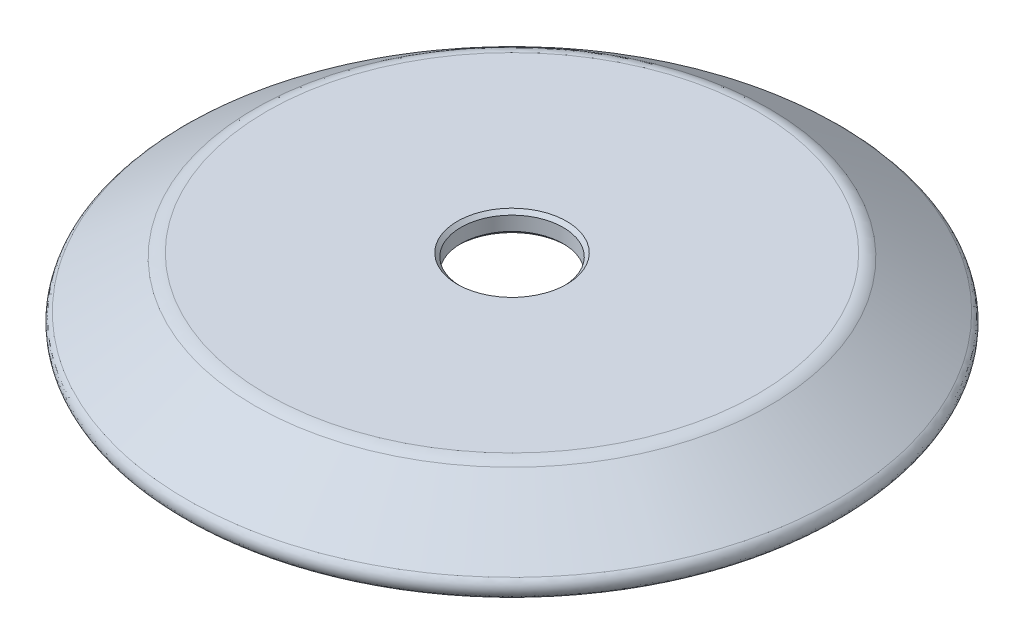
ISO-10303-21;
HEADER;
FILE_DESCRIPTION(('STEP AP214'),'2;1');
FILE_NAME('part.step','',(''),(''),'','','');
FILE_SCHEMA(('AUTOMOTIVE_DESIGN { 1 0 10303 214 1 1 1 1 }'));
ENDSEC;
DATA;
#1=APPLICATION_CONTEXT('core data for automotive mechanical design processes');
#2=APPLICATION_PROTOCOL_DEFINITION('international standard','automotive_design',2000,#1);
#3=PRODUCT_CONTEXT('',#1,'mechanical');
#4=PRODUCT('Part','Part','',(#3));
#5=PRODUCT_RELATED_PRODUCT_CATEGORY('part','',(#4));
#6=PRODUCT_DEFINITION_FORMATION('','',#4);
#7=PRODUCT_DEFINITION_CONTEXT('part definition',#1,'design');
#8=PRODUCT_DEFINITION('design','',#6,#7);
#9=PRODUCT_DEFINITION_SHAPE('','',#8);
#10=(LENGTH_UNIT() NAMED_UNIT(*) SI_UNIT(.MILLI.,.METRE.));
#11=(NAMED_UNIT(*) PLANE_ANGLE_UNIT() SI_UNIT($,.RADIAN.));
#12=(NAMED_UNIT(*) SI_UNIT($,.STERADIAN.) SOLID_ANGLE_UNIT());
#13=UNCERTAINTY_MEASURE_WITH_UNIT(LENGTH_MEASURE(1.E-05),#10,'distance_accuracy_value','');
#14=(GEOMETRIC_REPRESENTATION_CONTEXT(3) GLOBAL_UNCERTAINTY_ASSIGNED_CONTEXT((#13)) GLOBAL_UNIT_ASSIGNED_CONTEXT((#10,
#11,#12)) REPRESENTATION_CONTEXT('',''));
#15=CARTESIAN_POINT('',(0.,0.,0.));
#16=DIRECTION('',(0.,0.,1.));
#17=DIRECTION('',(1.,0.,0.));
#18=AXIS2_PLACEMENT_3D('',#15,#16,#17);
#19=CARTESIAN_POINT('',(-2.5034535638788E-12,2.72872806643349,-46.1029724509817));
#20=CARTESIAN_POINT('',(-6.03707294563587,2.72872806644456,-46.1029724509656));
#21=CARTESIAN_POINT('',(-12.0653156088882,2.72872806647997,-44.903880431653));
#22=CARTESIAN_POINT('',(-23.2203718706661,2.72872806638704,-40.2833048391326));
#23=CARTESIAN_POINT('',(-28.3308692345403,2.72872806642062,-36.8685796713777));
#24=CARTESIAN_POINT('',(-36.8685796713548,2.72872806644637,-28.3308692345103));
#25=CARTESIAN_POINT('',(-40.283304839094,2.72872806643817,-23.2203718705701));
#26=CARTESIAN_POINT('',(-44.9038804316953,2.72872806642883,-12.065315608975));
#27=CARTESIAN_POINT('',(-46.1029724509819,2.72872806643364,-6.03707294569086));
#28=CARTESIAN_POINT('',(-46.1029724509816,2.72872806643333,6.03707294569586));
#29=CARTESIAN_POINT('',(-44.9038804317165,2.72872806641405,12.0653156089808));
#30=CARTESIAN_POINT('',(-40.283304839069,2.72872806645297,23.2203718705736));
#31=CARTESIAN_POINT('',(-36.8685796713791,2.72872806637898,28.330869234623));
#32=CARTESIAN_POINT('',(-28.3308692345089,2.72872806648803,36.8685796712721));
#33=CARTESIAN_POINT('',(-23.220371870538,2.72872806647551,40.2833048390496));
#34=CARTESIAN_POINT('',(-12.0653156090071,2.72872806639147,44.9038804317398));
#35=CARTESIAN_POINT('',(-6.03707294565799,2.72872806642242,46.1029724509979));
#36=CARTESIAN_POINT('',(6.03707294566301,2.72872806644456,46.1029724509656));
#37=CARTESIAN_POINT('',(12.0653156089407,2.72872806639748,44.9038804317587));
#38=CARTESIAN_POINT('',(23.2203718706135,2.72872806646963,40.2833048390267));
#39=CARTESIAN_POINT('',(28.3308692346949,2.72872806630778,36.868579671451));
#40=CARTESIAN_POINT('',(36.8685796712002,2.72872806655919,28.330869234437));
#41=CARTESIAN_POINT('',(40.2833048390501,2.72872806645609,23.2203718706094));
#42=CARTESIAN_POINT('',(44.9038804317392,2.72872806641101,12.0653156089356));
#43=CARTESIAN_POINT('',(46.1029724509807,2.72872806643448,6.03707294563086));
#44=CARTESIAN_POINT('',(46.1029724509828,2.7287280664325,-6.03707294563587));
#45=CARTESIAN_POINT('',(44.9038804317659,2.72872806636164,-12.0653156090573));
#46=CARTESIAN_POINT('',(40.2833048390197,2.72872806650534,-23.2203718704971));
#47=CARTESIAN_POINT('',(36.8685796713803,2.72872806640802,-28.3308692345632));
#48=CARTESIAN_POINT('',(28.3308692345077,2.72872806645898,-36.8685796713319));
#49=CARTESIAN_POINT('',(23.2203718704771,2.72872806651793,-40.2833048390092));
#50=CARTESIAN_POINT('',(12.0653156090679,2.72872806634905,-44.9038804317802));
#51=CARTESIAN_POINT('',(6.03707294563086,2.72872806642242,-46.1029724509979));
#52=CARTESIAN_POINT('',(-2.5034535638788E-12,2.72872806643349,-46.1029724509817));
#53=CARTESIAN_POINT('',(-2.54827876254248E-12,2.15515163008244,-46.9221244952707));
#54=CARTESIAN_POINT('',(-6.14565629281166,2.15515163009134,-46.9221244952504));
#55=CARTESIAN_POINT('',(-12.2784735926816,2.15515163014219,-45.7022312874216));
#56=CARTESIAN_POINT('',(-23.6341657187477,2.15515163002274,-40.9985495988307));
#57=CARTESIAN_POINT('',(-28.83331717872,2.1551516300545,-37.5245876578507));
#58=CARTESIAN_POINT('',(-37.5245876578542,2.15515163011042,-28.8333171787164));
#59=CARTESIAN_POINT('',(-40.9985495988123,2.15515163009263,-23.6341657186007));
#60=CARTESIAN_POINT('',(-45.7022312874439,2.1551516300723,-12.2784735928192));
#61=CARTESIAN_POINT('',(-46.9221244952707,2.15515163008244,-6.14565629292368));
#62=CARTESIAN_POINT('',(-46.9221244952707,2.15515163008244,6.14565629292877));
#63=CARTESIAN_POINT('',(-45.7022312874419,2.15515163003927,12.2784735928239));
#64=CARTESIAN_POINT('',(-40.9985495988103,2.15515163012568,23.6341657186054));
#65=CARTESIAN_POINT('',(-37.5245876577897,2.15515162998843,28.8333171788217));
#66=CARTESIAN_POINT('',(-28.8333171787774,2.1551516301765,37.5245876577526));
#67=CARTESIAN_POINT('',(-23.63416571856,2.1551516301536,40.9985495988123));
#68=CARTESIAN_POINT('',(-12.2784735928599,2.15515163001128,45.7022312874439));
#69=CARTESIAN_POINT('',(-6.14565629285954,2.15515163007101,46.9221244952911));
#70=CARTESIAN_POINT('',(6.14565629286465,2.15515163009388,46.9221244952504));
#71=CARTESIAN_POINT('',(12.2784735927323,2.15515163002028,45.7022312875029));
#72=CARTESIAN_POINT('',(23.6341657186968,2.15515163014481,40.9985495987493));
#73=CARTESIAN_POINT('',(28.8333171788624,2.15515162988929,37.524587657871));
#74=CARTESIAN_POINT('',(37.5245876577119,2.1551516302756,28.8333171786961));
#75=CARTESIAN_POINT('',(40.9985495987716,2.15515163012574,23.6341657186717));
#76=CARTESIAN_POINT('',(45.7022312874845,2.15515163003933,12.278473592748));
#77=CARTESIAN_POINT('',(46.9221244952707,2.15515163008498,6.14565629280657));
#78=CARTESIAN_POINT('',(46.9221244952707,2.1551516300799,-6.14565629281167));
#79=CARTESIAN_POINT('',(45.7022312874826,2.15515162997825,-12.2784735929459));
#80=CARTESIAN_POINT('',(40.9985495987697,2.15515163018665,-23.6341657184833));
#81=CARTESIAN_POINT('',(37.5245876578506,2.15515163003798,-28.8333171787404));
#82=CARTESIAN_POINT('',(28.8333171787164,2.15515163012694,-37.5245876578339));
#83=CARTESIAN_POINT('',(23.6341657184786,2.1551516302235,-40.9985495988123));
#84=CARTESIAN_POINT('',(12.2784735929411,2.15515162994139,-45.7022312874439));
#85=CARTESIAN_POINT('',(6.14565629280657,2.15515163007355,-46.9221244952911));
#86=CARTESIAN_POINT('',(-2.54827876254248E-12,2.15515163008244,-46.9221244952707));
#87=CARTESIAN_POINT('',(-2.58095078049475E-12,0.823817051426892,-47.5158822233687));
#88=CARTESIAN_POINT('',(-6.22436231810856,0.823817051451672,-47.515882223328));
#89=CARTESIAN_POINT('',(-12.4329799521126,0.823817051497757,-46.2809113916969));
#90=CARTESIAN_POINT('',(-23.9341018500804,0.823817051356068,-41.5169907190756));
#91=CARTESIAN_POINT('',(-29.197513730384,0.823817051419282,-38.0000913379657));
#92=CARTESIAN_POINT('',(-38.0000913380302,0.823817051434531,-29.1975137304414));
#93=CARTESIAN_POINT('',(-41.5169907191995,0.823817051417701,-23.9341018499028));
#94=CARTESIAN_POINT('',(-46.2809113915769,0.823817051436127,-12.4329799522807));
#95=CARTESIAN_POINT('',(-47.5158822233687,0.823817051426892,-6.22436231827691));
#96=CARTESIAN_POINT('',(-47.5158822233687,0.823817051426892,6.22436231828207));
#97=CARTESIAN_POINT('',(-46.2809113915749,0.823817051389117,12.4329799523058));
#98=CARTESIAN_POINT('',(-41.5169907191975,0.823817051464727,23.9341018498872));
#99=CARTESIAN_POINT('',(-38.0000913379046,0.823817051325884,29.197513730506));
#100=CARTESIAN_POINT('',(-29.1975137305024,0.823817051527934,38.0000913379083));
#101=CARTESIAN_POINT('',(-23.9341018498621,0.823817051484712,41.5169907191792));
#102=CARTESIAN_POINT('',(-12.4329799523213,0.823817051369073,46.2809113915972));
#103=CARTESIAN_POINT('',(-6.22436231816649,0.823817051441508,47.5158822233484));
#104=CARTESIAN_POINT('',(6.22436231817167,0.82381705141228,47.515882223389));
#105=CARTESIAN_POINT('',(12.4329799521227,0.823817051366624,46.280911391697));
#106=CARTESIAN_POINT('',(23.9341018500701,0.823817051487346,41.5169907190756));
#107=CARTESIAN_POINT('',(29.1975137304654,0.82381705120197,38.0000913378843));
#108=CARTESIAN_POINT('',(38.0000913379489,0.823817051651819,29.1975137305227));
#109=CARTESIAN_POINT('',(41.5169907190572,0.823817051498783,23.9341018499942));
#110=CARTESIAN_POINT('',(46.2809113917193,0.823817051355187,12.4329799521891));
#111=CARTESIAN_POINT('',(47.5158822233484,0.823817051426892,6.22436231807452));
#112=CARTESIAN_POINT('',(47.515882223389,0.823817051426892,-6.22436231807969));
#113=CARTESIAN_POINT('',(46.2809113915749,0.823817051278214,-12.4329799524582));
#114=CARTESIAN_POINT('',(41.5169907191976,0.823817051575571,-23.9341018497347));
#115=CARTESIAN_POINT('',(38.0000913379453,0.823817051384972,-29.197513730445));
#116=CARTESIAN_POINT('',(29.1975137304617,0.823817051468842,-38.0000913379693));
#117=CARTESIAN_POINT('',(23.9341018497706,0.823817051553338,-41.5169907192605));
#118=CARTESIAN_POINT('',(12.4329799524128,0.823817051300458,-46.2809113915159));
#119=CARTESIAN_POINT('',(6.2243623181034,0.823817051402112,-47.5158822234094));
#120=CARTESIAN_POINT('',(-2.58095078049475E-12,0.823817051426892,-47.5158822233687));
#121=CARTESIAN_POINT('',(-2.53423181974011E-12,-0.404911015006596,-46.6555175688421));
#122=CARTESIAN_POINT('',(-6.11031600076284,-0.404911014977209,-46.6555175688218));
#123=CARTESIAN_POINT('',(-12.2090977114299,-0.404911014952268,-45.442394460713));
#124=CARTESIAN_POINT('',(-23.4994894926033,-0.404911015060918,-40.7657610604331));
#125=CARTESIAN_POINT('',(-28.6697869732652,-0.404911014985467,-37.3110787320666));
#126=CARTESIAN_POINT('',(-37.3110787321311,-0.40491101502772,-28.6697869733227));
#127=CARTESIAN_POINT('',(-40.7657610605164,-0.404911015042648,-23.499489492436));
#128=CARTESIAN_POINT('',(-45.4423944606336,-0.404911014970533,-12.2090977115879));
#129=CARTESIAN_POINT('',(-46.6555175688421,-0.404911015006596,-6.1103160009013));
#130=CARTESIAN_POINT('',(-46.6555175688421,-0.404911015006596,6.11031600090636));
#131=CARTESIAN_POINT('',(-45.442394460591,-0.404911015011664,12.2090977115926));
#132=CARTESIAN_POINT('',(-40.7657610605551,-0.404911015001498,23.4994894924406));
#133=CARTESIAN_POINT('',(-37.3110787320055,-0.404911015064885,28.6697869733465));
#134=CARTESIAN_POINT('',(-28.6697869733836,-0.404911014948293,37.3110787320498));
#135=CARTESIAN_POINT('',(-23.4994894924156,-0.404911014999289,40.765761060557));
#136=CARTESIAN_POINT('',(-12.2090977116082,-0.404911015013902,45.4423944605929));
#137=CARTESIAN_POINT('',(-6.11031600077653,-0.404911014960369,46.6555175688421));
#138=CARTESIAN_POINT('',(6.11031600078161,-0.404911015052817,46.6555175688421));
#139=CARTESIAN_POINT('',(12.2090977114502,-0.404911015033893,45.442394460652));
#140=CARTESIAN_POINT('',(23.4994894925829,-0.40491101497925,40.7657610604941));
#141=CARTESIAN_POINT('',(28.6697869732856,-0.404911015143515,37.3110787320055));
#142=CARTESIAN_POINT('',(37.3110787321108,-0.404911014869666,28.6697869733836));
#143=CARTESIAN_POINT('',(40.7657610604757,-0.404911014931742,23.4994894925376));
#144=CARTESIAN_POINT('',(45.4423944606743,-0.404911015081373,12.2090977114862));
#145=CARTESIAN_POINT('',(46.6555175688828,-0.404911015008819,6.11031600067115));
#146=CARTESIAN_POINT('',(46.6555175688015,-0.404911015004372,-6.11031600067622));
#147=CARTESIAN_POINT('',(45.44239446053,-0.404911015130185,-12.2090977117857));
#148=CARTESIAN_POINT('',(40.7657610606161,-0.404911014883023,-23.4994894922475));
#149=CARTESIAN_POINT('',(37.3110787320665,-0.404911015028038,-28.6697869733059));
#150=CARTESIAN_POINT('',(28.6697869733226,-0.404911014985149,-37.3110787320905));
#151=CARTESIAN_POINT('',(23.4994894923343,-0.404911014973071,-40.7657610606383));
#152=CARTESIAN_POINT('',(12.2090977116895,-0.404911015040103,-45.4423944605116));
#153=CARTESIAN_POINT('',(6.11031600075777,-0.404911015035982,-46.6555175688624));
#154=CARTESIAN_POINT('',(-2.53423181974011E-12,-0.404911015006596,-46.6555175688421));
#155=CARTESIAN_POINT('',(-2.45484084103319E-12,-0.302304502784533,-45.2013951862176));
#156=CARTESIAN_POINT('',(-5.91756365812024,-0.302304502772143,-45.2013951862176));
#157=CARTESIAN_POINT('',(-11.8307091113772,-0.302304502762294,-44.025197425474));
#158=CARTESIAN_POINT('',(-22.7649410037326,-0.302304502806771,-39.4960902815254));
#159=CARTESIAN_POINT('',(-27.7778636645027,-0.302304502775637,-36.1465624460322));
#160=CARTESIAN_POINT('',(-36.1465624460356,-0.302304502793428,-27.7778636644993));
#161=CARTESIAN_POINT('',(-39.4960902815273,-0.302304502800416,-22.7649410036772));
#162=CARTESIAN_POINT('',(-44.0251974254759,-0.302304502768647,-11.8307091114235));
#163=CARTESIAN_POINT('',(-45.2013951862176,-0.302304502784533,-5.91756365817245));
#164=CARTESIAN_POINT('',(-45.2013951862176,-0.302304502784533,5.91756365817735));
#165=CARTESIAN_POINT('',(-44.0251974254334,-0.302304502785799,11.830709111428));
#166=CARTESIAN_POINT('',(-39.4960902815661,-0.302304502783257,22.7649410036817));
#167=CARTESIAN_POINT('',(-36.1465624459915,-0.302304502807087,27.7778636645231));
#168=CARTESIAN_POINT('',(-27.7778636645399,-0.302304502761975,36.1465624460153));
#169=CARTESIAN_POINT('',(-22.7649410036569,-0.302304502782945,39.4960902815679));
#170=CARTESIAN_POINT('',(-11.8307091114438,-0.302304502786122,44.0251974254352));
#171=CARTESIAN_POINT('',(-5.91756365807962,-0.302304502764836,45.2013951862176));
#172=CARTESIAN_POINT('',(5.91756365808454,-0.302304502804229,45.2013951862176));
#173=CARTESIAN_POINT('',(11.8307091113771,-0.30230450279469,44.0251974254537));
#174=CARTESIAN_POINT('',(22.7649410037325,-0.302304502774358,39.4960902815457));
#175=CARTESIAN_POINT('',(27.7778636644621,-0.302304502840762,36.1465624460118));
#176=CARTESIAN_POINT('',(36.1465624460763,-0.3023045027283,27.7778636645196));
#177=CARTESIAN_POINT('',(39.4960902815679,-0.302304502752432,22.7649410037179));
#178=CARTESIAN_POINT('',(44.0251974254353,-0.302304502816605,11.8307091113828));
#179=CARTESIAN_POINT('',(45.2013951862176,-0.302304502785169,5.91756365799982));
#180=CARTESIAN_POINT('',(45.2013951862176,-0.302304502783898,-5.91756365800473));
#181=CARTESIAN_POINT('',(44.025197425352,-0.30230450283632,-11.8307091115805));
#182=CARTESIAN_POINT('',(39.4960902816474,-0.302304502732754,-22.7649410035292));
#183=CARTESIAN_POINT('',(36.1465624460525,-0.302304502792793,-27.7778636644824));
#184=CARTESIAN_POINT('',(27.7778636644789,-0.302304502776273,-36.1465624460559));
#185=CARTESIAN_POINT('',(22.7649410036365,-0.302304502770869,-39.4960902815883));
#186=CARTESIAN_POINT('',(11.8307091114641,-0.302304502798191,-44.0251974254149));
#187=CARTESIAN_POINT('',(5.91756365811533,-0.302304502796923,-45.2013951862176));
#188=CARTESIAN_POINT('',(-2.45484084103319E-12,-0.302304502784533,-45.2013951862176));
#189=CARTESIAN_POINT('',(-2.41001564236951E-12,0.271271933566512,-44.3822431419286));
#190=CARTESIAN_POINT('',(-5.80898031094444,0.271271933566364,-44.3822431419285));
#191=CARTESIAN_POINT('',(-11.6175511275745,0.271271933575168,-43.2268465696869));
#192=CARTESIAN_POINT('',(-22.3511471556604,0.271271933557858,-38.7808455218458));
#193=CARTESIAN_POINT('',(-27.2754157203005,0.271271933565824,-35.4905544595571));
#194=CARTESIAN_POINT('',(-35.4905544595586,0.271271933567202,-27.2754157202953));
#195=CARTESIAN_POINT('',(-38.7808455218322,0.271271933570481,-22.3511471556478));
#196=CARTESIAN_POINT('',(-43.2268465697042,0.271271933562546,-11.6175511275782));
#197=CARTESIAN_POINT('',(-44.3822431419287,0.27127193356666,-5.80898031093962));
#198=CARTESIAN_POINT('',(-44.3822431419285,0.271271933566364,5.80898031094444));
#199=CARTESIAN_POINT('',(-43.2268465696897,0.271271933573078,11.6175511275756));
#200=CARTESIAN_POINT('',(-38.780845521843,0.271271933559949,22.3511471556593));
#201=CARTESIAN_POINT('',(-35.4905544595579,0.271271933564989,27.2754157203014));
#202=CARTESIAN_POINT('',(-27.2754157202944,0.271271933568037,35.4905544595578));
#203=CARTESIAN_POINT('',(-22.3511471556472,0.271271933571733,38.7808455218305));
#204=CARTESIAN_POINT('',(-11.6175511275789,0.27127193356129,43.2268465697058));
#205=CARTESIAN_POINT('',(-5.80898031087808,0.27127193356666,44.3822431419287));
#206=CARTESIAN_POINT('',(5.80898031088291,0.271271933566363,44.3822431419285));
#207=CARTESIAN_POINT('',(11.6175511275833,0.271271933561591,43.2268465697042));
#208=CARTESIAN_POINT('',(22.3511471556515,0.271271933571446,38.7808455218285));
#209=CARTESIAN_POINT('',(27.2754157202827,0.271271933563317,35.4905544595799));
#210=CARTESIAN_POINT('',(35.4905544595764,0.271271933569708,27.2754157202724));
#211=CARTESIAN_POINT('',(38.7808455218439,0.271271933561086,22.3511471556545));
#212=CARTESIAN_POINT('',(43.2268465696924,0.271271933571949,11.6175511275715));
#213=CARTESIAN_POINT('',(44.3822431419281,0.271271933567078,5.80898031082411));
#214=CARTESIAN_POINT('',(44.3822431419291,0.271271933565945,-5.80898031082894));
#215=CARTESIAN_POINT('',(43.2268465696491,0.271271933569365,-11.6175511276874));
#216=CARTESIAN_POINT('',(38.7808455218836,0.271271933563659,-22.3511471555474));
#217=CARTESIAN_POINT('',(35.4905544595744,0.271271933558652,-27.2754157202976));
#218=CARTESIAN_POINT('',(27.2754157202779,0.271271933574373,-35.4905544595615));
#219=CARTESIAN_POINT('',(22.351147155646,0.271271933573827,-38.7808455218278));
#220=CARTESIAN_POINT('',(11.61755112758,0.271271933559197,-43.2268465697086));
#221=CARTESIAN_POINT('',(5.80898031093962,0.27127193356666,-44.3822431419287));
#222=CARTESIAN_POINT('',(-2.41001564236951E-12,0.271271933566512,-44.3822431419286));
#223=(BOUNDED_SURFACE() B_SPLINE_SURFACE(5,3,((#19,#20,#21,#22,#23,#24,#25,#26,#27,#28,#29,#30,
#31,#32,#33,#34,#35,#36,#37,#38,#39,#40,#41,#42,#43,#44,#45,#46,#47,#48,#49,#50,#51,#52),(#53,
#54,#55,#56,#57,#58,#59,#60,#61,#62,#63,#64,#65,#66,#67,#68,#69,#70,#71,#72,#73,#74,#75,#76,#77,
#78,#79,#80,#81,#82,#83,#84,#85,#86),(#87,#88,#89,#90,#91,#92,#93,#94,#95,#96,#97,#98,#99,#100,
#101,#102,#103,#104,#105,#106,#107,#108,#109,#110,#111,#112,#113,#114,#115,#116,#117,#118,#119,
#120),(#121,#122,#123,#124,#125,#126,#127,#128,#129,#130,#131,#132,#133,#134,#135,#136,#137,
#138,#139,#140,#141,#142,#143,#144,#145,#146,#147,#148,#149,#150,#151,#152,#153,#154),(#155,
#156,#157,#158,#159,#160,#161,#162,#163,#164,#165,#166,#167,#168,#169,#170,#171,#172,#173,#174,
#175,#176,#177,#178,#179,#180,#181,#182,#183,#184,#185,#186,#187,#188),(#189,#190,#191,#192,
#193,#194,#195,#196,#197,#198,#199,#200,#201,#202,#203,#204,#205,#206,#207,#208,#209,#210,#211,
#212,#213,#214,#215,#216,#217,#218,#219,#220,#221,#222)),.UNSPECIFIED.,.F.,.T.,
.F.) B_SPLINE_SURFACE_WITH_KNOTS((6,6),(4,2,2,2,2,2,2,2,2,2,2,2,2,2,2,2,4),(0.,1.),
(0.500000000000009,0.562500000000009,0.625000000000009,0.687500000000009,0.750000000000009,
0.812500000000009,0.875000000000009,0.937500000000009,1.00000000000001,1.06250000000001,
1.12500000000001,1.18750000000001,1.25000000000001,1.31250000000001,1.37500000000001,
1.43750000000001,1.50000000000001),
.UNSPECIFIED.) GEOMETRIC_REPRESENTATION_ITEM() RATIONAL_B_SPLINE_SURFACE(((1.,1.,1.,1.,1.,1.,1.,
1.,1.,1.,1.,1.,1.,1.,1.,1.,1.,1.,1.,1.,1.,1.,1.,1.,1.,1.,1.,1.,1.,1.,1.,1.,1.,1.),(0.6,0.6,
0.599999999999998,0.599999999999998,0.599999999999998,0.599999999999998,0.599999999999998,
0.599999999999998,0.6,0.6,0.599999999999999,0.599999999999999,0.599999999999999,
0.599999999999999,0.6,0.6,0.6,0.6,0.599999999999992,0.599999999999992,0.600000000000001,
0.600000000000001,0.599999999999994,0.599999999999994,0.6,0.6,0.599999999999999,
0.599999999999999,0.599999999999998,0.599999999999998,0.600000000000001,0.600000000000001,0.6,
0.6),(0.4,0.4,0.399999999999997,0.399999999999997,0.399999999999998,0.399999999999998,
0.399999999999997,0.399999999999997,0.4,0.4,0.399999999999998,0.399999999999998,
0.399999999999999,0.399999999999999,0.4,0.4,0.4,0.4,0.399999999999988,0.399999999999988,
0.400000000000001,0.400000000000001,0.399999999999991,0.399999999999991,0.4,0.4,
0.399999999999998,0.399999999999998,0.399999999999998,0.399999999999998,0.400000000000002,
0.400000000000002,0.4,0.4),(0.4,0.4,0.399999999999997,0.399999999999997,0.399999999999998,
0.399999999999998,0.399999999999997,0.399999999999997,0.4,0.4,0.399999999999998,
0.399999999999998,0.399999999999999,0.399999999999999,0.4,0.4,0.4,0.4,0.399999999999988,
0.399999999999988,0.400000000000001,0.400000000000001,0.399999999999991,0.399999999999991,0.4,
0.4,0.399999999999998,0.399999999999998,0.399999999999998,0.399999999999998,0.400000000000002,
0.400000000000002,0.4,0.4),(0.6,0.6,0.599999999999998,0.599999999999998,0.599999999999998,
0.599999999999998,0.599999999999998,0.599999999999998,0.6,0.6,0.599999999999999,
0.599999999999999,0.599999999999999,0.599999999999999,0.6,0.6,0.6,0.6,0.599999999999992,
0.599999999999992,0.600000000000001,0.600000000000001,0.599999999999994,0.599999999999994,0.6,
0.6,0.599999999999999,0.599999999999999,0.599999999999998,0.599999999999998,0.600000000000001,
0.600000000000001,0.6,0.6),(1.,1.,1.,1.,1.,1.,1.,1.,1.,1.,1.,1.,1.,1.,1.,1.,1.,1.,1.,1.,1.,1.,
1.,1.,1.,1.,1.,1.,1.,1.,1.,1.,1.,1.))) REPRESENTATION_ITEM('') SURFACE());
#224=CARTESIAN_POINT('',(-2.41001564236951E-12,0.271271933566512,-44.3822431419286));
#225=CARTESIAN_POINT('',(-5.80898031094444,0.271271933566364,-44.3822431419285));
#226=CARTESIAN_POINT('',(-11.6175511275745,0.271271933575168,-43.2268465696869));
#227=CARTESIAN_POINT('',(-22.3511471556604,0.271271933557858,-38.7808455218458));
#228=CARTESIAN_POINT('',(-27.2754157203005,0.271271933565824,-35.4905544595571));
#229=CARTESIAN_POINT('',(-35.4905544595586,0.271271933567202,-27.2754157202953));
#230=CARTESIAN_POINT('',(-38.7808455218322,0.271271933570481,-22.3511471556478));
#231=CARTESIAN_POINT('',(-43.2268465697042,0.271271933562546,-11.6175511275782));
#232=CARTESIAN_POINT('',(-44.3822431419287,0.27127193356666,-5.80898031093962));
#233=CARTESIAN_POINT('',(-44.3822431419285,0.271271933566364,5.80898031094444));
#234=CARTESIAN_POINT('',(-43.2268465696897,0.271271933573078,11.6175511275756));
#235=CARTESIAN_POINT('',(-38.780845521843,0.271271933559949,22.3511471556593));
#236=CARTESIAN_POINT('',(-35.4905544595579,0.271271933564989,27.2754157203014));
#237=CARTESIAN_POINT('',(-27.2754157202944,0.271271933568037,35.4905544595578));
#238=CARTESIAN_POINT('',(-22.3511471556472,0.271271933571733,38.7808455218305));
#239=CARTESIAN_POINT('',(-11.6175511275789,0.27127193356129,43.2268465697058));
#240=CARTESIAN_POINT('',(-5.80898031087808,0.27127193356666,44.3822431419287));
#241=CARTESIAN_POINT('',(5.80898031088291,0.271271933566363,44.3822431419285));
#242=CARTESIAN_POINT('',(11.6175511275833,0.271271933561591,43.2268465697042));
#243=CARTESIAN_POINT('',(22.3511471556515,0.271271933571446,38.7808455218285));
#244=CARTESIAN_POINT('',(27.2754157202827,0.271271933563317,35.4905544595799));
#245=CARTESIAN_POINT('',(35.4905544595764,0.271271933569708,27.2754157202724));
#246=CARTESIAN_POINT('',(38.7808455218439,0.271271933561086,22.3511471556545));
#247=CARTESIAN_POINT('',(43.2268465696924,0.271271933571949,11.6175511275715));
#248=CARTESIAN_POINT('',(44.3822431419281,0.271271933567078,5.80898031082411));
#249=CARTESIAN_POINT('',(44.3822431419291,0.271271933565945,-5.80898031082894));
#250=CARTESIAN_POINT('',(43.2268465696491,0.271271933569365,-11.6175511276874));
#251=CARTESIAN_POINT('',(38.7808455218836,0.271271933563659,-22.3511471555474));
#252=CARTESIAN_POINT('',(35.4905544595744,0.271271933558652,-27.2754157202976));
#253=CARTESIAN_POINT('',(27.2754157202779,0.271271933574373,-35.4905544595615));
#254=CARTESIAN_POINT('',(22.351147155646,0.271271933573827,-38.7808455218278));
#255=CARTESIAN_POINT('',(11.61755112758,0.271271933559197,-43.2268465697086));
#256=CARTESIAN_POINT('',(5.80898031093962,0.27127193356666,-44.3822431419287));
#257=CARTESIAN_POINT('',(-2.41001564236951E-12,0.271271933566512,-44.3822431419286));
#258=(BOUNDED_CURVE() B_SPLINE_CURVE(3,(#224,#225,#226,#227,#228,#229,#230,#231,#232,#233,#234,
#235,#236,#237,#238,#239,#240,#241,#242,#243,#244,#245,#246,#247,#248,#249,#250,#251,#252,#253,
#254,#255,#256,#257),.UNSPECIFIED.,.T.,.F.) B_SPLINE_CURVE_WITH_KNOTS((4,2,2,2,2,2,2,2,2,2,2,2,
2,2,2,2,4),(0.500000000000009,0.562500000000009,0.625000000000009,0.687500000000009,
0.750000000000009,0.812500000000009,0.875000000000009,0.937500000000009,1.00000000000001,
1.06250000000001,1.12500000000001,1.18750000000001,1.25000000000001,1.31250000000001,
1.37500000000001,1.43750000000001,1.50000000000001),
.UNSPECIFIED.) CURVE() GEOMETRIC_REPRESENTATION_ITEM() RATIONAL_B_SPLINE_CURVE((1.,1.,1.,1.,1.,
1.,1.,1.,1.,1.,1.,1.,1.,1.,1.,1.,1.,1.,1.,1.,1.,1.,1.,1.,1.,1.,1.,1.,1.,1.,1.,1.,1.,1.)) REPRESENTATION_ITEM(''));
#259=CARTESIAN_POINT('',(-2.41001564236951E-12,0.271271933566512,-44.3822431419286));
#260=VERTEX_POINT('',#259);
#261=EDGE_CURVE('E118',#260,#260,#258,.F.);
#262=CARTESIAN_POINT('',(-2.5034535638788E-12,2.72872806643349,-46.1029724509817));
#263=CARTESIAN_POINT('',(6.03707294563086,2.72872806642242,-46.1029724509979));
#264=CARTESIAN_POINT('',(12.0653156090679,2.72872806634905,-44.9038804317802));
#265=CARTESIAN_POINT('',(23.2203718704771,2.72872806651793,-40.2833048390092));
#266=CARTESIAN_POINT('',(28.3308692345077,2.72872806645898,-36.8685796713319));
#267=CARTESIAN_POINT('',(36.8685796713803,2.72872806640802,-28.3308692345632));
#268=CARTESIAN_POINT('',(40.2833048390197,2.72872806650534,-23.2203718704971));
#269=CARTESIAN_POINT('',(44.9038804317659,2.72872806636164,-12.0653156090573));
#270=CARTESIAN_POINT('',(46.1029724509828,2.7287280664325,-6.03707294563587));
#271=CARTESIAN_POINT('',(46.1029724509807,2.72872806643448,6.03707294563086));
#272=CARTESIAN_POINT('',(44.9038804317392,2.72872806641101,12.0653156089356));
#273=CARTESIAN_POINT('',(40.2833048390501,2.72872806645609,23.2203718706094));
#274=CARTESIAN_POINT('',(36.8685796712002,2.72872806655919,28.330869234437));
#275=CARTESIAN_POINT('',(28.3308692346949,2.72872806630778,36.868579671451));
#276=CARTESIAN_POINT('',(23.2203718706135,2.72872806646963,40.2833048390267));
#277=CARTESIAN_POINT('',(12.0653156089407,2.72872806639748,44.9038804317587));
#278=CARTESIAN_POINT('',(6.03707294566301,2.72872806644456,46.1029724509656));
#279=CARTESIAN_POINT('',(-6.03707294565799,2.72872806642242,46.1029724509979));
#280=CARTESIAN_POINT('',(-12.0653156090071,2.72872806639147,44.9038804317398));
#281=CARTESIAN_POINT('',(-23.220371870538,2.72872806647551,40.2833048390496));
#282=CARTESIAN_POINT('',(-28.3308692345089,2.72872806648803,36.8685796712721));
#283=CARTESIAN_POINT('',(-36.8685796713791,2.72872806637898,28.330869234623));
#284=CARTESIAN_POINT('',(-40.283304839069,2.72872806645297,23.2203718705736));
#285=CARTESIAN_POINT('',(-44.9038804317165,2.72872806641405,12.0653156089808));
#286=CARTESIAN_POINT('',(-46.1029724509816,2.72872806643333,6.03707294569586));
#287=CARTESIAN_POINT('',(-46.1029724509819,2.72872806643364,-6.03707294569086));
#288=CARTESIAN_POINT('',(-44.9038804316953,2.72872806642883,-12.065315608975));
#289=CARTESIAN_POINT('',(-40.283304839094,2.72872806643817,-23.2203718705701));
#290=CARTESIAN_POINT('',(-36.8685796713548,2.72872806644637,-28.3308692345103));
#291=CARTESIAN_POINT('',(-28.3308692345403,2.72872806642062,-36.8685796713777));
#292=CARTESIAN_POINT('',(-23.2203718706661,2.72872806638704,-40.2833048391326));
#293=CARTESIAN_POINT('',(-12.0653156088882,2.72872806647997,-44.903880431653));
#294=CARTESIAN_POINT('',(-6.03707294563587,2.72872806644456,-46.1029724509656));
#295=CARTESIAN_POINT('',(-2.5034535638788E-12,2.72872806643349,-46.1029724509817));
#296=(BOUNDED_CURVE() B_SPLINE_CURVE(3,(#262,#263,#264,#265,#266,#267,#268,#269,#270,#271,#272,
#273,#274,#275,#276,#277,#278,#279,#280,#281,#282,#283,#284,#285,#286,#287,#288,#289,#290,#291,
#292,#293,#294,#295),.UNSPECIFIED.,.T.,.F.) B_SPLINE_CURVE_WITH_KNOTS((4,2,2,2,2,2,2,2,2,2,2,2,
2,2,2,2,4),(0.500000000000009,0.562500000000009,0.625000000000009,0.687500000000009,
0.750000000000009,0.812500000000009,0.875000000000009,0.937500000000009,1.00000000000001,
1.06250000000001,1.12500000000001,1.18750000000001,1.25000000000001,1.31250000000001,
1.37500000000001,1.43750000000001,1.50000000000001),
.UNSPECIFIED.) CURVE() GEOMETRIC_REPRESENTATION_ITEM() RATIONAL_B_SPLINE_CURVE((1.,1.,1.,1.,1.,
1.,1.,1.,1.,1.,1.,1.,1.,1.,1.,1.,1.,1.,1.,1.,1.,1.,1.,1.,1.,1.,1.,1.,1.,1.,1.,1.,1.,1.)) REPRESENTATION_ITEM(''));
#297=CARTESIAN_POINT('',(-2.5034535638788E-12,2.72872806643349,-46.1029724509817));
#298=VERTEX_POINT('',#297);
#299=EDGE_CURVE('E75',#298,#298,#296,.F.);
#300=ORIENTED_EDGE('',*,*,#261,.F.);
#301=EDGE_LOOP('',(#300));
#302=FACE_BOUND('',#301,.T.);
#303=ORIENTED_EDGE('',*,*,#299,.F.);
#304=EDGE_LOOP('',(#303));
#305=FACE_BOUND('',#304,.T.);
#306=ADVANCED_FACE('F43',(#302,#305),#223,.T.);
#307=CARTESIAN_POINT('',(0.,0.,0.));
#308=DIRECTION('',(0.,-1.,0.));
#309=DIRECTION('',(0.,0.,1.));
#310=AXIS2_PLACEMENT_3D('',#307,#308,#309);
#311=CONICAL_SURFACE('',#310,50.,0.959931088596882);
#312=CARTESIAN_POINT('',(0.,9.45745613286696,0.));
#313=DIRECTION('',(0.,-1.,0.));
#314=DIRECTION('',(0.,0.,-1.));
#315=AXIS2_PLACEMENT_3D('',#312,#313,#314);
#316=CIRCLE('',#315,36.493352874995);
#317=CARTESIAN_POINT('',(0.,9.45745613286696,-36.493352874995));
#318=VERTEX_POINT('',#317);
#319=EDGE_CURVE('E10',#318,#318,#316,.T.);
#320=ORIENTED_EDGE('',*,*,#319,.T.);
#321=EDGE_LOOP('',(#320));
#322=FACE_BOUND('',#321,.T.);
#323=ORIENTED_EDGE('',*,*,#299,.T.);
#324=EDGE_LOOP('',(#323));
#325=FACE_BOUND('',#324,.T.);
#326=ADVANCED_FACE('F96',(#322,#325),#311,.T.);
#327=CARTESIAN_POINT('',(0.,10.,0.));
#328=DIRECTION('',(0.,1.,0.));
#329=DIRECTION('',(0.,0.,1.));
#330=AXIS2_PLACEMENT_3D('',#327,#328,#329);
#331=PLANE('',#330);
#332=CARTESIAN_POINT('',(0.,10.,0.));
#333=DIRECTION('',(0.,1.,0.));
#334=DIRECTION('',(0.,0.,1.));
#335=AXIS2_PLACEMENT_3D('',#332,#333,#334);
#336=CIRCLE('',#335,34.7726235659419);
#337=CARTESIAN_POINT('',(0.,10.,34.7726235659419));
#338=VERTEX_POINT('',#337);
#339=EDGE_CURVE('E51',#338,#338,#336,.T.);
#340=ORIENTED_EDGE('',*,*,#339,.T.);
#341=EDGE_LOOP('',(#340));
#342=FACE_BOUND('',#341,.T.);
#343=CARTESIAN_POINT('',(0.,10.,0.));
#344=DIRECTION('',(0.,1.,0.));
#345=DIRECTION('',(0.,0.,1.));
#346=AXIS2_PLACEMENT_3D('',#343,#344,#345);
#347=CIRCLE('',#346,7.74999999999999);
#348=CARTESIAN_POINT('',(0.,10.,7.74999999999999));
#349=VERTEX_POINT('',#348);
#350=EDGE_CURVE('E56',#349,#349,#347,.F.);
#351=ORIENTED_EDGE('',*,*,#350,.T.);
#352=EDGE_LOOP('',(#351));
#353=FACE_BOUND('',#352,.T.);
#354=ADVANCED_FACE('F146',(#342,#353),#331,.T.);
#355=CARTESIAN_POINT('',(0.,-2.45745613286698,0.));
#356=DIRECTION('',(0.,-1.,0.));
#357=DIRECTION('',(0.,0.,1.));
#358=AXIS2_PLACEMENT_3D('',#355,#356,#357);
#359=CONICAL_SURFACE('',#358,48.2792706909469,0.959931088596882);
#360=ORIENTED_EDGE('',*,*,#261,.T.);
#361=EDGE_LOOP('',(#360));
#362=FACE_BOUND('',#361,.T.);
#363=CARTESIAN_POINT('',(0.,7.,0.));
#364=DIRECTION('',(0.,1.,0.));
#365=DIRECTION('',(0.,0.,1.));
#366=AXIS2_PLACEMENT_3D('',#363,#364,#365);
#367=CIRCLE('',#366,34.7726235659419);
#368=CARTESIAN_POINT('',(0.,7.,34.7726235659419));
#369=VERTEX_POINT('',#368);
#370=EDGE_CURVE('E248',#369,#369,#367,.T.);
#371=ORIENTED_EDGE('',*,*,#370,.T.);
#372=EDGE_LOOP('',(#371));
#373=FACE_BOUND('',#372,.T.);
#374=ADVANCED_FACE('F135',(#362,#373),#359,.F.);
#375=CARTESIAN_POINT('',(0.,7.,0.));
#376=DIRECTION('',(0.,1.,0.));
#377=DIRECTION('',(0.,0.,1.));
#378=AXIS2_PLACEMENT_3D('',#375,#376,#377);
#379=PLANE('',#378);
#380=CARTESIAN_POINT('',(0.,7.,0.));
#381=DIRECTION('',(0.,1.,0.));
#382=DIRECTION('',(0.,0.,1.));
#383=AXIS2_PLACEMENT_3D('',#380,#381,#382);
#384=CIRCLE('',#383,7.75000000000001);
#385=CARTESIAN_POINT('',(0.,7.,7.75000000000001));
#386=VERTEX_POINT('',#385);
#387=EDGE_CURVE('E61',#386,#386,#384,.T.);
#388=ORIENTED_EDGE('',*,*,#387,.T.);
#389=EDGE_LOOP('',(#388));
#390=FACE_BOUND('',#389,.T.);
#391=ORIENTED_EDGE('',*,*,#370,.F.);
#392=EDGE_LOOP('',(#391));
#393=FACE_BOUND('',#392,.T.);
#394=ADVANCED_FACE('F145',(#390,#393),#379,.F.);
#395=CARTESIAN_POINT('',(0.,10.,0.));
#396=DIRECTION('',(0.,-1.,0.));
#397=DIRECTION('',(0.,0.,-1.));
#398=AXIS2_PLACEMENT_3D('',#395,#396,#397);
#399=CYLINDRICAL_SURFACE('',#398,7.25);
#400=CARTESIAN_POINT('',(0.,7.49999999999999,0.));
#401=DIRECTION('',(0.,1.,0.));
#402=DIRECTION('',(0.,0.,1.));
#403=AXIS2_PLACEMENT_3D('',#400,#401,#402);
#404=CIRCLE('',#403,7.25);
#405=CARTESIAN_POINT('',(0.,7.49999999999999,7.25));
#406=VERTEX_POINT('',#405);
#407=EDGE_CURVE('E67',#406,#406,#404,.F.);
#408=ORIENTED_EDGE('',*,*,#407,.T.);
#409=EDGE_LOOP('',(#408));
#410=FACE_BOUND('',#409,.T.);
#411=CARTESIAN_POINT('',(0.,9.50000000000001,0.));
#412=DIRECTION('',(0.,1.,0.));
#413=DIRECTION('',(0.,0.,1.));
#414=AXIS2_PLACEMENT_3D('',#411,#412,#413);
#415=CIRCLE('',#414,7.25);
#416=CARTESIAN_POINT('',(0.,9.50000000000001,7.25));
#417=VERTEX_POINT('',#416);
#418=EDGE_CURVE('E71',#417,#417,#415,.T.);
#419=ORIENTED_EDGE('',*,*,#418,.T.);
#420=EDGE_LOOP('',(#419));
#421=FACE_BOUND('',#420,.T.);
#422=ADVANCED_FACE('F148',(#410,#421),#399,.F.);
#423=CARTESIAN_POINT('',(0.,7.49999999999999,0.));
#424=DIRECTION('',(0.,-1.,0.));
#425=DIRECTION('',(0.,0.,-1.));
#426=AXIS2_PLACEMENT_3D('',#423,#424,#425);
#427=CONICAL_SURFACE('',#426,7.25,0.785398163397463);
#428=ORIENTED_EDGE('',*,*,#387,.F.);
#429=EDGE_LOOP('',(#428));
#430=FACE_BOUND('',#429,.T.);
#431=ORIENTED_EDGE('',*,*,#407,.F.);
#432=EDGE_LOOP('',(#431));
#433=FACE_BOUND('',#432,.T.);
#434=ADVANCED_FACE('F100',(#430,#433),#427,.F.);
#435=CARTESIAN_POINT('',(0.,10.,0.));
#436=DIRECTION('',(0.,1.,0.));
#437=DIRECTION('',(0.,0.,1.));
#438=AXIS2_PLACEMENT_3D('',#435,#436,#437);
#439=CONICAL_SURFACE('',#438,7.74999999999999,0.785398163397447);
#440=ORIENTED_EDGE('',*,*,#418,.F.);
#441=EDGE_LOOP('',(#440));
#442=FACE_BOUND('',#441,.T.);
#443=ORIENTED_EDGE('',*,*,#350,.F.);
#444=EDGE_LOOP('',(#443));
#445=FACE_BOUND('',#444,.T.);
#446=ADVANCED_FACE('F158',(#442,#445),#439,.F.);
#447=CARTESIAN_POINT('',(0.,7.,0.));
#448=DIRECTION('',(0.,1.,0.));
#449=DIRECTION('',(0.,0.,1.));
#450=AXIS2_PLACEMENT_3D('',#447,#448,#449);
#451=TOROIDAL_SURFACE('',#450,34.7726235659419,3.);
#452=ORIENTED_EDGE('',*,*,#319,.F.);
#453=EDGE_LOOP('',(#452));
#454=FACE_BOUND('',#453,.T.);
#455=ORIENTED_EDGE('',*,*,#339,.F.);
#456=EDGE_LOOP('',(#455));
#457=FACE_BOUND('',#456,.T.);
#458=ADVANCED_FACE('F45',(#454,#457),#451,.T.);
#459=CLOSED_SHELL('',(#306,#326,#354,#374,#394,#422,#434,#446,#458));
#460=MANIFOLD_SOLID_BREP('B2',#459);
#461=ADVANCED_BREP_SHAPE_REPRESENTATION('',(#18,#460),#14);
#462=SHAPE_DEFINITION_REPRESENTATION(#9,#461);
ENDSEC;
END-ISO-10303-21;
